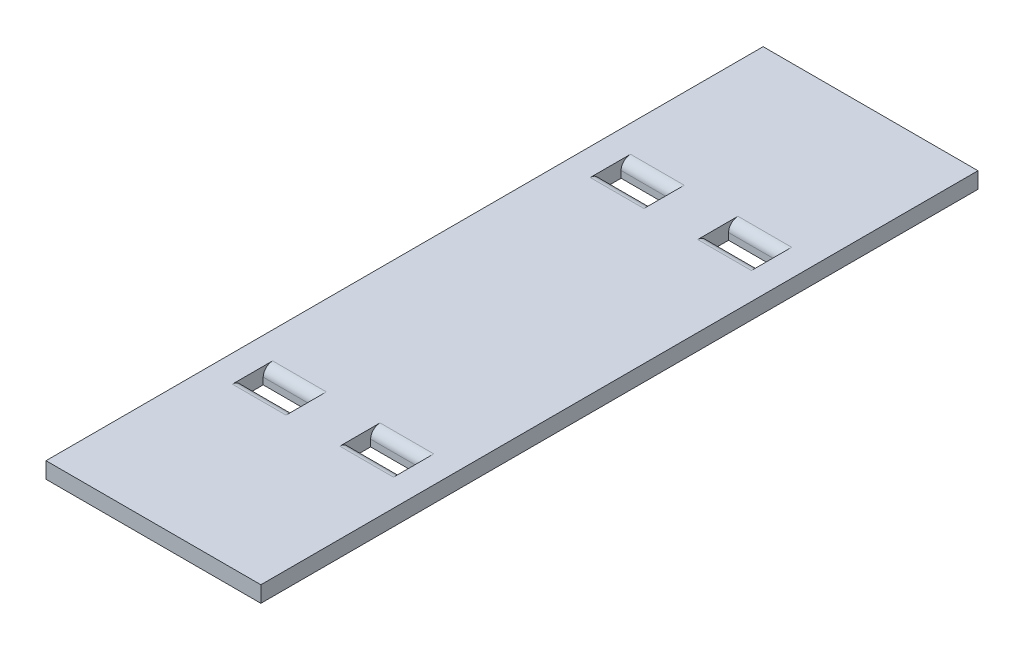
ISO-10303-21;
HEADER;
FILE_DESCRIPTION(('STEP AP214'),'2;1');
FILE_NAME('part.step','',(''),(''),'','','');
FILE_SCHEMA(('AUTOMOTIVE_DESIGN { 1 0 10303 214 1 1 1 1 }'));
ENDSEC;
DATA;
#1=APPLICATION_CONTEXT('core data for automotive mechanical design processes');
#2=APPLICATION_PROTOCOL_DEFINITION('international standard','automotive_design',2000,#1);
#3=PRODUCT_CONTEXT('',#1,'mechanical');
#4=PRODUCT('Part','Part','',(#3));
#5=PRODUCT_RELATED_PRODUCT_CATEGORY('part','',(#4));
#6=PRODUCT_DEFINITION_FORMATION('','',#4);
#7=PRODUCT_DEFINITION_CONTEXT('part definition',#1,'design');
#8=PRODUCT_DEFINITION('design','',#6,#7);
#9=PRODUCT_DEFINITION_SHAPE('','',#8);
#10=(LENGTH_UNIT() NAMED_UNIT(*) SI_UNIT(.MILLI.,.METRE.));
#11=(NAMED_UNIT(*) PLANE_ANGLE_UNIT() SI_UNIT($,.RADIAN.));
#12=(NAMED_UNIT(*) SI_UNIT($,.STERADIAN.) SOLID_ANGLE_UNIT());
#13=UNCERTAINTY_MEASURE_WITH_UNIT(LENGTH_MEASURE(1.E-05),#10,'distance_accuracy_value','');
#14=(GEOMETRIC_REPRESENTATION_CONTEXT(3) GLOBAL_UNCERTAINTY_ASSIGNED_CONTEXT((#13)) GLOBAL_UNIT_ASSIGNED_CONTEXT((#10,
#11,#12)) REPRESENTATION_CONTEXT('',''));
#15=CARTESIAN_POINT('',(0.,0.,0.));
#16=DIRECTION('',(0.,0.,1.));
#17=DIRECTION('',(1.,0.,0.));
#18=AXIS2_PLACEMENT_3D('',#15,#16,#17);
#19=CARTESIAN_POINT('',(20.,3.,-66.75));
#20=DIRECTION('',(-1.,0.,0.));
#21=DIRECTION('',(0.,0.,1.));
#22=AXIS2_PLACEMENT_3D('',#19,#20,#21);
#23=PLANE('',#22);
#24=DIRECTION('',(0.,0.,-1.));
#25=VECTOR('',#24,1.);
#26=CARTESIAN_POINT('',(20.,0.,-66.75));
#27=LINE('',#26,#25);
#28=CARTESIAN_POINT('',(20.,0.,66.75));
#29=VERTEX_POINT('',#28);
#30=CARTESIAN_POINT('',(20.,0.,-66.75));
#31=VERTEX_POINT('',#30);
#32=EDGE_CURVE('E340',#29,#31,#27,.T.);
#33=ORIENTED_EDGE('',*,*,#32,.T.);
#34=DIRECTION('',(0.,-1.,0.));
#35=VECTOR('',#34,1.);
#36=CARTESIAN_POINT('',(20.,3.,-66.75));
#37=LINE('',#36,#35);
#38=CARTESIAN_POINT('',(20.,3.,-66.75));
#39=VERTEX_POINT('',#38);
#40=EDGE_CURVE('E367',#39,#31,#37,.T.);
#41=ORIENTED_EDGE('',*,*,#40,.F.);
#42=DIRECTION('',(0.,0.,-1.));
#43=VECTOR('',#42,1.);
#44=CARTESIAN_POINT('',(20.,3.,-66.75));
#45=LINE('',#44,#43);
#46=CARTESIAN_POINT('',(20.,3.,66.75));
#47=VERTEX_POINT('',#46);
#48=EDGE_CURVE('E341',#47,#39,#45,.T.);
#49=ORIENTED_EDGE('',*,*,#48,.F.);
#50=DIRECTION('',(0.,-1.,0.));
#51=VECTOR('',#50,1.);
#52=CARTESIAN_POINT('',(20.,3.,66.75));
#53=LINE('',#52,#51);
#54=EDGE_CURVE('E351',#47,#29,#53,.T.);
#55=ORIENTED_EDGE('',*,*,#54,.T.);
#56=EDGE_LOOP('',(#33,#41,#49,#55));
#57=FACE_BOUND('',#56,.T.);
#58=ADVANCED_FACE('F41',(#57),#23,.F.);
#59=CARTESIAN_POINT('',(-20.,3.,-66.75));
#60=DIRECTION('',(0.,0.,1.));
#61=DIRECTION('',(1.,0.,0.));
#62=AXIS2_PLACEMENT_3D('',#59,#60,#61);
#63=PLANE('',#62);
#64=DIRECTION('',(-1.,0.,0.));
#65=VECTOR('',#64,1.);
#66=CARTESIAN_POINT('',(-20.,0.,-66.75));
#67=LINE('',#66,#65);
#68=CARTESIAN_POINT('',(-20.,0.,-66.75));
#69=VERTEX_POINT('',#68);
#70=EDGE_CURVE('E354',#31,#69,#67,.T.);
#71=ORIENTED_EDGE('',*,*,#70,.T.);
#72=DIRECTION('',(0.,-1.,0.));
#73=VECTOR('',#72,1.);
#74=CARTESIAN_POINT('',(-20.,3.,-66.75));
#75=LINE('',#74,#73);
#76=CARTESIAN_POINT('',(-20.,3.,-66.75));
#77=VERTEX_POINT('',#76);
#78=EDGE_CURVE('E364',#77,#69,#75,.T.);
#79=ORIENTED_EDGE('',*,*,#78,.F.);
#80=DIRECTION('',(-1.,0.,0.));
#81=VECTOR('',#80,1.);
#82=CARTESIAN_POINT('',(-20.,3.,-66.75));
#83=LINE('',#82,#81);
#84=EDGE_CURVE('E344',#39,#77,#83,.T.);
#85=ORIENTED_EDGE('',*,*,#84,.F.);
#86=ORIENTED_EDGE('',*,*,#40,.T.);
#87=EDGE_LOOP('',(#71,#79,#85,#86));
#88=FACE_BOUND('',#87,.T.);
#89=ADVANCED_FACE('F495',(#88),#63,.F.);
#90=CARTESIAN_POINT('',(-20.,3.,-66.75));
#91=DIRECTION('',(1.,0.,0.));
#92=DIRECTION('',(0.,0.,-1.));
#93=AXIS2_PLACEMENT_3D('',#90,#91,#92);
#94=PLANE('',#93);
#95=DIRECTION('',(0.,0.,1.));
#96=VECTOR('',#95,1.);
#97=CARTESIAN_POINT('',(-20.,0.,-66.75));
#98=LINE('',#97,#96);
#99=CARTESIAN_POINT('',(-20.,0.,66.75));
#100=VERTEX_POINT('',#99);
#101=EDGE_CURVE('E356',#69,#100,#98,.T.);
#102=ORIENTED_EDGE('',*,*,#101,.T.);
#103=DIRECTION('',(0.,-1.,0.));
#104=VECTOR('',#103,1.);
#105=CARTESIAN_POINT('',(-20.,3.,66.75));
#106=LINE('',#105,#104);
#107=CARTESIAN_POINT('',(-20.,3.,66.75));
#108=VERTEX_POINT('',#107);
#109=EDGE_CURVE('E361',#108,#100,#106,.T.);
#110=ORIENTED_EDGE('',*,*,#109,.F.);
#111=DIRECTION('',(0.,0.,1.));
#112=VECTOR('',#111,1.);
#113=CARTESIAN_POINT('',(-20.,3.,-66.75));
#114=LINE('',#113,#112);
#115=EDGE_CURVE('E347',#77,#108,#114,.T.);
#116=ORIENTED_EDGE('',*,*,#115,.F.);
#117=ORIENTED_EDGE('',*,*,#78,.T.);
#118=EDGE_LOOP('',(#102,#110,#116,#117));
#119=FACE_BOUND('',#118,.T.);
#120=ADVANCED_FACE('F501',(#119),#94,.F.);
#121=CARTESIAN_POINT('',(-20.,3.,66.75));
#122=DIRECTION('',(0.,0.,-1.));
#123=DIRECTION('',(-1.,0.,0.));
#124=AXIS2_PLACEMENT_3D('',#121,#122,#123);
#125=PLANE('',#124);
#126=DIRECTION('',(1.,0.,0.));
#127=VECTOR('',#126,1.);
#128=CARTESIAN_POINT('',(-20.,0.,66.75));
#129=LINE('',#128,#127);
#130=EDGE_CURVE('E345',#100,#29,#129,.T.);
#131=ORIENTED_EDGE('',*,*,#130,.T.);
#132=ORIENTED_EDGE('',*,*,#54,.F.);
#133=DIRECTION('',(1.,0.,0.));
#134=VECTOR('',#133,1.);
#135=CARTESIAN_POINT('',(-20.,3.,66.75));
#136=LINE('',#135,#134);
#137=EDGE_CURVE('E349',#108,#47,#136,.T.);
#138=ORIENTED_EDGE('',*,*,#137,.F.);
#139=ORIENTED_EDGE('',*,*,#109,.T.);
#140=EDGE_LOOP('',(#131,#132,#138,#139));
#141=FACE_BOUND('',#140,.T.);
#142=ADVANCED_FACE('F570',(#141),#125,.F.);
#143=CARTESIAN_POINT('',(0.,3.,0.));
#144=DIRECTION('',(0.,1.,0.));
#145=DIRECTION('',(0.,0.,1.));
#146=AXIS2_PLACEMENT_3D('',#143,#144,#145);
#147=PLANE('',#146);
#148=DIRECTION('',(0.,0.,-1.));
#149=VECTOR('',#148,1.);
#150=CARTESIAN_POINT('',(15.,3.,35.3125));
#151=LINE('',#150,#149);
#152=CARTESIAN_POINT('',(15.,3.,37.0625));
#153=VERTEX_POINT('',#152);
#154=CARTESIAN_POINT('',(15.,3.,29.5625));
#155=VERTEX_POINT('',#154);
#156=EDGE_CURVE('E296',#153,#155,#151,.T.);
#157=ORIENTED_EDGE('',*,*,#156,.F.);
#158=DIRECTION('',(1.,0.,0.));
#159=VECTOR('',#158,1.);
#160=CARTESIAN_POINT('',(5.,3.,37.0625));
#161=LINE('',#160,#159);
#162=CARTESIAN_POINT('',(5.,3.,37.0625));
#163=VERTEX_POINT('',#162);
#164=EDGE_CURVE('E388',#153,#163,#161,.F.);
#165=ORIENTED_EDGE('',*,*,#164,.T.);
#166=DIRECTION('',(0.,0.,1.));
#167=VECTOR('',#166,1.);
#168=CARTESIAN_POINT('',(5.,3.,35.3125));
#169=LINE('',#168,#167);
#170=CARTESIAN_POINT('',(5.,3.,29.5625));
#171=VERTEX_POINT('',#170);
#172=EDGE_CURVE('E305',#171,#163,#169,.T.);
#173=ORIENTED_EDGE('',*,*,#172,.F.);
#174=DIRECTION('',(-1.,0.,0.));
#175=VECTOR('',#174,1.);
#176=CARTESIAN_POINT('',(15.,3.,29.5625));
#177=LINE('',#176,#175);
#178=EDGE_CURVE('E385',#171,#155,#177,.F.);
#179=ORIENTED_EDGE('',*,*,#178,.T.);
#180=EDGE_LOOP('',(#157,#165,#173,#179));
#181=FACE_BOUND('',#180,.T.);
#182=DIRECTION('',(0.,0.,-1.));
#183=VECTOR('',#182,1.);
#184=CARTESIAN_POINT('',(-5.,3.,35.3125));
#185=LINE('',#184,#183);
#186=CARTESIAN_POINT('',(-5.,3.,37.0625));
#187=VERTEX_POINT('',#186);
#188=CARTESIAN_POINT('',(-5.,3.,29.5625));
#189=VERTEX_POINT('',#188);
#190=EDGE_CURVE('E279',#187,#189,#185,.T.);
#191=ORIENTED_EDGE('',*,*,#190,.F.);
#192=DIRECTION('',(1.,0.,0.));
#193=VECTOR('',#192,1.);
#194=CARTESIAN_POINT('',(-15.,3.,37.0625));
#195=LINE('',#194,#193);
#196=CARTESIAN_POINT('',(-15.,3.,37.0625));
#197=VERTEX_POINT('',#196);
#198=EDGE_CURVE('E394',#187,#197,#195,.F.);
#199=ORIENTED_EDGE('',*,*,#198,.T.);
#200=DIRECTION('',(0.,0.,1.));
#201=VECTOR('',#200,1.);
#202=CARTESIAN_POINT('',(-15.,3.,35.3125));
#203=LINE('',#202,#201);
#204=CARTESIAN_POINT('',(-15.,3.,29.5625));
#205=VERTEX_POINT('',#204);
#206=EDGE_CURVE('E269',#205,#197,#203,.T.);
#207=ORIENTED_EDGE('',*,*,#206,.F.);
#208=DIRECTION('',(-1.,0.,0.));
#209=VECTOR('',#208,1.);
#210=CARTESIAN_POINT('',(-5.,3.,29.5625));
#211=LINE('',#210,#209);
#212=EDGE_CURVE('E391',#205,#189,#211,.F.);
#213=ORIENTED_EDGE('',*,*,#212,.T.);
#214=EDGE_LOOP('',(#191,#199,#207,#213));
#215=FACE_BOUND('',#214,.T.);
#216=DIRECTION('',(0.,0.,1.));
#217=VECTOR('',#216,1.);
#218=CARTESIAN_POINT('',(-15.,3.,-35.3125));
#219=LINE('',#218,#217);
#220=CARTESIAN_POINT('',(-15.,3.,-37.0625));
#221=VERTEX_POINT('',#220);
#222=CARTESIAN_POINT('',(-15.,3.,-29.5625));
#223=VERTEX_POINT('',#222);
#224=EDGE_CURVE('E937',#221,#223,#219,.T.);
#225=ORIENTED_EDGE('',*,*,#224,.F.);
#226=DIRECTION('',(-1.,0.,0.));
#227=VECTOR('',#226,1.);
#228=CARTESIAN_POINT('',(-5.,3.,-37.0625));
#229=LINE('',#228,#227);
#230=CARTESIAN_POINT('',(-5.,3.,-37.0625));
#231=VERTEX_POINT('',#230);
#232=EDGE_CURVE('E400',#221,#231,#229,.F.);
#233=ORIENTED_EDGE('',*,*,#232,.T.);
#234=DIRECTION('',(0.,0.,-1.));
#235=VECTOR('',#234,1.);
#236=CARTESIAN_POINT('',(-5.,3.,-35.3125));
#237=LINE('',#236,#235);
#238=CARTESIAN_POINT('',(-5.,3.,-29.5625));
#239=VERTEX_POINT('',#238);
#240=EDGE_CURVE('E251',#239,#231,#237,.T.);
#241=ORIENTED_EDGE('',*,*,#240,.F.);
#242=DIRECTION('',(1.,0.,0.));
#243=VECTOR('',#242,1.);
#244=CARTESIAN_POINT('',(-15.,3.,-29.5625));
#245=LINE('',#244,#243);
#246=EDGE_CURVE('E397',#239,#223,#245,.F.);
#247=ORIENTED_EDGE('',*,*,#246,.T.);
#248=EDGE_LOOP('',(#225,#233,#241,#247));
#249=FACE_BOUND('',#248,.T.);
#250=DIRECTION('',(0.,0.,1.));
#251=VECTOR('',#250,1.);
#252=CARTESIAN_POINT('',(5.,3.,-35.3125));
#253=LINE('',#252,#251);
#254=CARTESIAN_POINT('',(5.,3.,-37.0625));
#255=VERTEX_POINT('',#254);
#256=CARTESIAN_POINT('',(5.,3.,-29.5625));
#257=VERTEX_POINT('',#256);
#258=EDGE_CURVE('E323',#255,#257,#253,.T.);
#259=ORIENTED_EDGE('',*,*,#258,.F.);
#260=DIRECTION('',(-1.,0.,0.));
#261=VECTOR('',#260,1.);
#262=CARTESIAN_POINT('',(15.,3.,-37.0625));
#263=LINE('',#262,#261);
#264=CARTESIAN_POINT('',(15.,3.,-37.0625));
#265=VERTEX_POINT('',#264);
#266=EDGE_CURVE('E406',#255,#265,#263,.F.);
#267=ORIENTED_EDGE('',*,*,#266,.T.);
#268=DIRECTION('',(0.,0.,-1.));
#269=VECTOR('',#268,1.);
#270=CARTESIAN_POINT('',(15.,3.,-35.3125));
#271=LINE('',#270,#269);
#272=CARTESIAN_POINT('',(15.,3.,-29.5625));
#273=VERTEX_POINT('',#272);
#274=EDGE_CURVE('E321',#273,#265,#271,.T.);
#275=ORIENTED_EDGE('',*,*,#274,.F.);
#276=DIRECTION('',(1.,0.,0.));
#277=VECTOR('',#276,1.);
#278=CARTESIAN_POINT('',(5.,3.,-29.5625));
#279=LINE('',#278,#277);
#280=EDGE_CURVE('E403',#273,#257,#279,.F.);
#281=ORIENTED_EDGE('',*,*,#280,.T.);
#282=EDGE_LOOP('',(#259,#267,#275,#281));
#283=FACE_BOUND('',#282,.T.);
#284=ORIENTED_EDGE('',*,*,#48,.T.);
#285=ORIENTED_EDGE('',*,*,#84,.T.);
#286=ORIENTED_EDGE('',*,*,#115,.T.);
#287=ORIENTED_EDGE('',*,*,#137,.T.);
#288=EDGE_LOOP('',(#284,#285,#286,#287));
#289=FACE_BOUND('',#288,.T.);
#290=ADVANCED_FACE('F567',(#181,#215,#249,#283,#289),#147,.T.);
#291=CARTESIAN_POINT('',(0.,0.,0.));
#292=DIRECTION('',(0.,1.,0.));
#293=DIRECTION('',(0.,0.,1.));
#294=AXIS2_PLACEMENT_3D('',#291,#292,#293);
#295=PLANE('',#294);
#296=DIRECTION('',(1.,0.,0.));
#297=VECTOR('',#296,1.);
#298=CARTESIAN_POINT('',(5.,0.,31.3125));
#299=LINE('',#298,#297);
#300=CARTESIAN_POINT('',(5.,0.,31.3125));
#301=VERTEX_POINT('',#300);
#302=CARTESIAN_POINT('',(15.,0.,31.3125));
#303=VERTEX_POINT('',#302);
#304=EDGE_CURVE('E310',#301,#303,#299,.T.);
#305=ORIENTED_EDGE('',*,*,#304,.F.);
#306=DIRECTION('',(0.,0.,-1.));
#307=VECTOR('',#306,1.);
#308=CARTESIAN_POINT('',(5.,0.,35.3125));
#309=LINE('',#308,#307);
#310=CARTESIAN_POINT('',(5.,0.,35.3125));
#311=VERTEX_POINT('',#310);
#312=EDGE_CURVE('E307',#311,#301,#309,.T.);
#313=ORIENTED_EDGE('',*,*,#312,.F.);
#314=DIRECTION('',(-1.,0.,0.));
#315=VECTOR('',#314,1.);
#316=CARTESIAN_POINT('',(5.,0.,35.3125));
#317=LINE('',#316,#315);
#318=CARTESIAN_POINT('',(15.,0.,35.3125));
#319=VERTEX_POINT('',#318);
#320=EDGE_CURVE('E289',#319,#311,#317,.T.);
#321=ORIENTED_EDGE('',*,*,#320,.F.);
#322=DIRECTION('',(0.,0.,1.));
#323=VECTOR('',#322,1.);
#324=CARTESIAN_POINT('',(15.,0.,35.3125));
#325=LINE('',#324,#323);
#326=EDGE_CURVE('E265',#303,#319,#325,.T.);
#327=ORIENTED_EDGE('',*,*,#326,.F.);
#328=EDGE_LOOP('',(#305,#313,#321,#327));
#329=FACE_BOUND('',#328,.T.);
#330=DIRECTION('',(0.,0.,-1.));
#331=VECTOR('',#330,1.);
#332=CARTESIAN_POINT('',(-15.,0.,35.3125));
#333=LINE('',#332,#331);
#334=CARTESIAN_POINT('',(-15.,0.,35.3125));
#335=VERTEX_POINT('',#334);
#336=CARTESIAN_POINT('',(-15.,0.,31.3125));
#337=VERTEX_POINT('',#336);
#338=EDGE_CURVE('E284',#335,#337,#333,.T.);
#339=ORIENTED_EDGE('',*,*,#338,.F.);
#340=DIRECTION('',(-1.,0.,0.));
#341=VECTOR('',#340,1.);
#342=CARTESIAN_POINT('',(-5.,0.,35.3125));
#343=LINE('',#342,#341);
#344=CARTESIAN_POINT('',(-5.,0.,35.3125));
#345=VERTEX_POINT('',#344);
#346=EDGE_CURVE('E281',#345,#335,#343,.T.);
#347=ORIENTED_EDGE('',*,*,#346,.F.);
#348=DIRECTION('',(0.,0.,1.));
#349=VECTOR('',#348,1.);
#350=CARTESIAN_POINT('',(-5.,0.,35.3125));
#351=LINE('',#350,#349);
#352=CARTESIAN_POINT('',(-5.,0.,31.3125));
#353=VERTEX_POINT('',#352);
#354=EDGE_CURVE('E261',#353,#345,#351,.T.);
#355=ORIENTED_EDGE('',*,*,#354,.F.);
#356=DIRECTION('',(1.,0.,0.));
#357=VECTOR('',#356,1.);
#358=CARTESIAN_POINT('',(-5.,0.,31.3125));
#359=LINE('',#358,#357);
#360=EDGE_CURVE('E287',#337,#353,#359,.T.);
#361=ORIENTED_EDGE('',*,*,#360,.F.);
#362=EDGE_LOOP('',(#339,#347,#355,#361));
#363=FACE_BOUND('',#362,.T.);
#364=DIRECTION('',(-1.,0.,0.));
#365=VECTOR('',#364,1.);
#366=CARTESIAN_POINT('',(-5.,0.,-31.3125));
#367=LINE('',#366,#365);
#368=CARTESIAN_POINT('',(-5.,0.,-31.3125));
#369=VERTEX_POINT('',#368);
#370=CARTESIAN_POINT('',(-15.,0.,-31.3125));
#371=VERTEX_POINT('',#370);
#372=EDGE_CURVE('E234',#369,#371,#367,.T.);
#373=ORIENTED_EDGE('',*,*,#372,.F.);
#374=DIRECTION('',(0.,0.,1.));
#375=VECTOR('',#374,1.);
#376=CARTESIAN_POINT('',(-5.,0.,-35.3125));
#377=LINE('',#376,#375);
#378=CARTESIAN_POINT('',(-5.,0.,-35.3125));
#379=VERTEX_POINT('',#378);
#380=EDGE_CURVE('E244',#379,#369,#377,.T.);
#381=ORIENTED_EDGE('',*,*,#380,.F.);
#382=DIRECTION('',(1.,0.,0.));
#383=VECTOR('',#382,1.);
#384=CARTESIAN_POINT('',(-5.,0.,-35.3125));
#385=LINE('',#384,#383);
#386=CARTESIAN_POINT('',(-15.,0.,-35.3125));
#387=VERTEX_POINT('',#386);
#388=EDGE_CURVE('E241',#387,#379,#385,.T.);
#389=ORIENTED_EDGE('',*,*,#388,.F.);
#390=DIRECTION('',(0.,0.,-1.));
#391=VECTOR('',#390,1.);
#392=CARTESIAN_POINT('',(-15.,0.,-35.3125));
#393=LINE('',#392,#391);
#394=EDGE_CURVE('E255',#371,#387,#393,.T.);
#395=ORIENTED_EDGE('',*,*,#394,.F.);
#396=EDGE_LOOP('',(#373,#381,#389,#395));
#397=FACE_BOUND('',#396,.T.);
#398=DIRECTION('',(-1.,0.,0.));
#399=VECTOR('',#398,1.);
#400=CARTESIAN_POINT('',(5.,0.,-31.3125));
#401=LINE('',#400,#399);
#402=CARTESIAN_POINT('',(15.,0.,-31.3125));
#403=VERTEX_POINT('',#402);
#404=CARTESIAN_POINT('',(5.,0.,-31.3125));
#405=VERTEX_POINT('',#404);
#406=EDGE_CURVE('E315',#403,#405,#401,.T.);
#407=ORIENTED_EDGE('',*,*,#406,.F.);
#408=DIRECTION('',(0.,0.,1.));
#409=VECTOR('',#408,1.);
#410=CARTESIAN_POINT('',(15.,0.,-35.3125));
#411=LINE('',#410,#409);
#412=CARTESIAN_POINT('',(15.,0.,-35.3125));
#413=VERTEX_POINT('',#412);
#414=EDGE_CURVE('E318',#413,#403,#411,.T.);
#415=ORIENTED_EDGE('',*,*,#414,.F.);
#416=DIRECTION('',(1.,0.,0.));
#417=VECTOR('',#416,1.);
#418=CARTESIAN_POINT('',(5.,0.,-35.3125));
#419=LINE('',#418,#417);
#420=CARTESIAN_POINT('',(5.,0.,-35.3125));
#421=VERTEX_POINT('',#420);
#422=EDGE_CURVE('E329',#421,#413,#419,.T.);
#423=ORIENTED_EDGE('',*,*,#422,.F.);
#424=DIRECTION('',(0.,0.,-1.));
#425=VECTOR('',#424,1.);
#426=CARTESIAN_POINT('',(5.,0.,-35.3125));
#427=LINE('',#426,#425);
#428=EDGE_CURVE('E257',#405,#421,#427,.T.);
#429=ORIENTED_EDGE('',*,*,#428,.F.);
#430=EDGE_LOOP('',(#407,#415,#423,#429));
#431=FACE_BOUND('',#430,.T.);
#432=CARTESIAN_POINT('',(10.,0.,-56.75));
#433=DIRECTION('',(0.,1.,0.));
#434=DIRECTION('',(0.,0.,1.));
#435=AXIS2_PLACEMENT_3D('',#432,#433,#434);
#436=CIRCLE('',#435,6.11);
#437=CARTESIAN_POINT('',(10.,0.,-50.64));
#438=VERTEX_POINT('',#437);
#439=EDGE_CURVE('E379',#438,#438,#436,.F.);
#440=ORIENTED_EDGE('',*,*,#439,.F.);
#441=EDGE_LOOP('',(#440));
#442=FACE_BOUND('',#441,.T.);
#443=CARTESIAN_POINT('',(-10.,0.,-56.75));
#444=DIRECTION('',(0.,1.,0.));
#445=DIRECTION('',(0.,0.,1.));
#446=AXIS2_PLACEMENT_3D('',#443,#444,#445);
#447=CIRCLE('',#446,6.11);
#448=CARTESIAN_POINT('',(-10.,0.,-50.64));
#449=VERTEX_POINT('',#448);
#450=EDGE_CURVE('E376',#449,#449,#447,.F.);
#451=ORIENTED_EDGE('',*,*,#450,.F.);
#452=EDGE_LOOP('',(#451));
#453=FACE_BOUND('',#452,.T.);
#454=CARTESIAN_POINT('',(-10.,0.,56.75));
#455=DIRECTION('',(0.,1.,0.));
#456=DIRECTION('',(0.,0.,1.));
#457=AXIS2_PLACEMENT_3D('',#454,#455,#456);
#458=CIRCLE('',#457,6.11);
#459=CARTESIAN_POINT('',(-10.,0.,62.86));
#460=VERTEX_POINT('',#459);
#461=EDGE_CURVE('E373',#460,#460,#458,.F.);
#462=ORIENTED_EDGE('',*,*,#461,.F.);
#463=EDGE_LOOP('',(#462));
#464=FACE_BOUND('',#463,.T.);
#465=CARTESIAN_POINT('',(10.,0.,56.75));
#466=DIRECTION('',(0.,1.,0.));
#467=DIRECTION('',(0.,0.,1.));
#468=AXIS2_PLACEMENT_3D('',#465,#466,#467);
#469=CIRCLE('',#468,6.11);
#470=CARTESIAN_POINT('',(10.,0.,62.86));
#471=VERTEX_POINT('',#470);
#472=EDGE_CURVE('E370',#471,#471,#469,.F.);
#473=ORIENTED_EDGE('',*,*,#472,.F.);
#474=EDGE_LOOP('',(#473));
#475=FACE_BOUND('',#474,.T.);
#476=ORIENTED_EDGE('',*,*,#32,.F.);
#477=ORIENTED_EDGE('',*,*,#130,.F.);
#478=ORIENTED_EDGE('',*,*,#101,.F.);
#479=ORIENTED_EDGE('',*,*,#70,.F.);
#480=EDGE_LOOP('',(#476,#477,#478,#479));
#481=FACE_BOUND('',#480,.T.);
#482=ADVANCED_FACE('F253',(#329,#363,#397,#431,#442,#453,#464,#475,#481),#295,.F.);
#483=CARTESIAN_POINT('',(10.,-3.,56.75));
#484=DIRECTION('',(0.,1.,0.));
#485=DIRECTION('',(0.,0.,1.));
#486=AXIS2_PLACEMENT_3D('',#483,#484,#485);
#487=CYLINDRICAL_SURFACE('',#486,6.11);
#488=CARTESIAN_POINT('',(10.,-2.,56.75));
#489=DIRECTION('',(0.,-1.,0.));
#490=DIRECTION('',(0.,0.,-1.));
#491=AXIS2_PLACEMENT_3D('',#488,#489,#490);
#492=CIRCLE('',#491,6.11);
#493=CARTESIAN_POINT('',(10.,-2.,50.64));
#494=VERTEX_POINT('',#493);
#495=EDGE_CURVE('E472',#494,#494,#492,.F.);
#496=ORIENTED_EDGE('',*,*,#495,.T.);
#497=EDGE_LOOP('',(#496));
#498=FACE_BOUND('',#497,.T.);
#499=ORIENTED_EDGE('',*,*,#472,.T.);
#500=EDGE_LOOP('',(#499));
#501=FACE_BOUND('',#500,.T.);
#502=ADVANCED_FACE('F553',(#498,#501),#487,.T.);
#503=CARTESIAN_POINT('',(10.,-3.,56.75));
#504=DIRECTION('',(0.,-1.,0.));
#505=DIRECTION('',(0.,0.,-1.));
#506=AXIS2_PLACEMENT_3D('',#503,#504,#505);
#507=PLANE('',#506);
#508=CARTESIAN_POINT('',(10.,-3.,56.75));
#509=DIRECTION('',(0.,-1.,0.));
#510=DIRECTION('',(0.,0.,-1.));
#511=AXIS2_PLACEMENT_3D('',#508,#509,#510);
#512=CIRCLE('',#511,5.11);
#513=CARTESIAN_POINT('',(10.,-3.,51.64));
#514=VERTEX_POINT('',#513);
#515=EDGE_CURVE('E469',#514,#514,#512,.T.);
#516=ORIENTED_EDGE('',*,*,#515,.T.);
#517=EDGE_LOOP('',(#516));
#518=FACE_BOUND('',#517,.T.);
#519=ADVANCED_FACE('F550',(#518),#507,.T.);
#520=CARTESIAN_POINT('',(-10.,-3.,56.75));
#521=DIRECTION('',(0.,1.,0.));
#522=DIRECTION('',(0.,0.,1.));
#523=AXIS2_PLACEMENT_3D('',#520,#521,#522);
#524=CYLINDRICAL_SURFACE('',#523,6.11);
#525=CARTESIAN_POINT('',(-10.,-2.,56.75));
#526=DIRECTION('',(0.,1.,0.));
#527=DIRECTION('',(0.,0.,1.));
#528=AXIS2_PLACEMENT_3D('',#525,#526,#527);
#529=CIRCLE('',#528,6.11);
#530=CARTESIAN_POINT('',(-10.,-2.,62.86));
#531=VERTEX_POINT('',#530);
#532=EDGE_CURVE('E466',#531,#531,#529,.T.);
#533=ORIENTED_EDGE('',*,*,#532,.T.);
#534=EDGE_LOOP('',(#533));
#535=FACE_BOUND('',#534,.T.);
#536=ORIENTED_EDGE('',*,*,#461,.T.);
#537=EDGE_LOOP('',(#536));
#538=FACE_BOUND('',#537,.T.);
#539=ADVANCED_FACE('F552',(#535,#538),#524,.T.);
#540=CARTESIAN_POINT('',(-10.,-3.,56.75));
#541=DIRECTION('',(0.,1.,0.));
#542=DIRECTION('',(0.,0.,1.));
#543=AXIS2_PLACEMENT_3D('',#540,#541,#542);
#544=PLANE('',#543);
#545=CARTESIAN_POINT('',(-10.,-3.,56.75));
#546=DIRECTION('',(0.,1.,0.));
#547=DIRECTION('',(0.,0.,1.));
#548=AXIS2_PLACEMENT_3D('',#545,#546,#547);
#549=CIRCLE('',#548,5.11);
#550=CARTESIAN_POINT('',(-10.,-3.,61.86));
#551=VERTEX_POINT('',#550);
#552=EDGE_CURVE('E463',#551,#551,#549,.F.);
#553=ORIENTED_EDGE('',*,*,#552,.T.);
#554=EDGE_LOOP('',(#553));
#555=FACE_BOUND('',#554,.T.);
#556=ADVANCED_FACE('F559',(#555),#544,.F.);
#557=CARTESIAN_POINT('',(-10.,-3.,-56.75));
#558=DIRECTION('',(0.,1.,0.));
#559=DIRECTION('',(0.,0.,1.));
#560=AXIS2_PLACEMENT_3D('',#557,#558,#559);
#561=CYLINDRICAL_SURFACE('',#560,6.11);
#562=CARTESIAN_POINT('',(-10.,-2.,-56.75));
#563=DIRECTION('',(0.,-1.,0.));
#564=DIRECTION('',(0.,0.,-1.));
#565=AXIS2_PLACEMENT_3D('',#562,#563,#564);
#566=CIRCLE('',#565,6.11);
#567=CARTESIAN_POINT('',(-10.,-2.,-62.86));
#568=VERTEX_POINT('',#567);
#569=EDGE_CURVE('E478',#568,#568,#566,.F.);
#570=ORIENTED_EDGE('',*,*,#569,.T.);
#571=EDGE_LOOP('',(#570));
#572=FACE_BOUND('',#571,.T.);
#573=ORIENTED_EDGE('',*,*,#450,.T.);
#574=EDGE_LOOP('',(#573));
#575=FACE_BOUND('',#574,.T.);
#576=ADVANCED_FACE('F815',(#572,#575),#561,.T.);
#577=CARTESIAN_POINT('',(-10.,-3.,-56.75));
#578=DIRECTION('',(0.,-1.,0.));
#579=DIRECTION('',(0.,0.,-1.));
#580=AXIS2_PLACEMENT_3D('',#577,#578,#579);
#581=PLANE('',#580);
#582=CARTESIAN_POINT('',(-10.,-3.,-56.75));
#583=DIRECTION('',(0.,-1.,0.));
#584=DIRECTION('',(0.,0.,-1.));
#585=AXIS2_PLACEMENT_3D('',#582,#583,#584);
#586=CIRCLE('',#585,5.11);
#587=CARTESIAN_POINT('',(-10.,-3.,-61.86));
#588=VERTEX_POINT('',#587);
#589=EDGE_CURVE('E475',#588,#588,#586,.T.);
#590=ORIENTED_EDGE('',*,*,#589,.T.);
#591=EDGE_LOOP('',(#590));
#592=FACE_BOUND('',#591,.T.);
#593=ADVANCED_FACE('F825',(#592),#581,.T.);
#594=CARTESIAN_POINT('',(10.,-3.,-56.75));
#595=DIRECTION('',(0.,1.,0.));
#596=DIRECTION('',(0.,0.,1.));
#597=AXIS2_PLACEMENT_3D('',#594,#595,#596);
#598=CYLINDRICAL_SURFACE('',#597,6.11);
#599=CARTESIAN_POINT('',(10.,-2.,-56.75));
#600=DIRECTION('',(0.,1.,0.));
#601=DIRECTION('',(0.,0.,1.));
#602=AXIS2_PLACEMENT_3D('',#599,#600,#601);
#603=CIRCLE('',#602,6.11);
#604=CARTESIAN_POINT('',(10.,-2.,-50.64));
#605=VERTEX_POINT('',#604);
#606=EDGE_CURVE('E11',#605,#605,#603,.T.);
#607=ORIENTED_EDGE('',*,*,#606,.T.);
#608=EDGE_LOOP('',(#607));
#609=FACE_BOUND('',#608,.T.);
#610=ORIENTED_EDGE('',*,*,#439,.T.);
#611=EDGE_LOOP('',(#610));
#612=FACE_BOUND('',#611,.T.);
#613=ADVANCED_FACE('F835',(#609,#612),#598,.T.);
#614=CARTESIAN_POINT('',(10.,-3.,-56.75));
#615=DIRECTION('',(0.,1.,0.));
#616=DIRECTION('',(0.,0.,1.));
#617=AXIS2_PLACEMENT_3D('',#614,#615,#616);
#618=PLANE('',#617);
#619=CARTESIAN_POINT('',(10.,-3.,-56.75));
#620=DIRECTION('',(0.,1.,0.));
#621=DIRECTION('',(0.,0.,1.));
#622=AXIS2_PLACEMENT_3D('',#619,#620,#621);
#623=CIRCLE('',#622,5.11);
#624=CARTESIAN_POINT('',(10.,-3.,-51.64));
#625=VERTEX_POINT('',#624);
#626=EDGE_CURVE('E49',#625,#625,#623,.F.);
#627=ORIENTED_EDGE('',*,*,#626,.T.);
#628=EDGE_LOOP('',(#627));
#629=FACE_BOUND('',#628,.T.);
#630=ADVANCED_FACE('F483',(#629),#618,.F.);
#631=CARTESIAN_POINT('',(15.,-3.001,-35.3125));
#632=DIRECTION('',(1.,0.,0.));
#633=DIRECTION('',(0.,0.,-1.));
#634=AXIS2_PLACEMENT_3D('',#631,#632,#633);
#635=PLANE('',#634);
#636=ORIENTED_EDGE('',*,*,#414,.T.);
#637=DIRECTION('',(0.,1.,0.));
#638=VECTOR('',#637,1.);
#639=CARTESIAN_POINT('',(15.,-3.001,-31.3125));
#640=LINE('',#639,#638);
#641=CARTESIAN_POINT('',(15.,1.25,-31.3125));
#642=VERTEX_POINT('',#641);
#643=EDGE_CURVE('E326',#403,#642,#640,.T.);
#644=ORIENTED_EDGE('',*,*,#643,.T.);
#645=CARTESIAN_POINT('',(15.,1.25,-29.5625));
#646=DIRECTION('',(1.,0.,0.));
#647=DIRECTION('',(0.,0.,-1.));
#648=AXIS2_PLACEMENT_3D('',#645,#646,#647);
#649=CIRCLE('',#648,1.75);
#650=EDGE_CURVE('E432',#642,#273,#649,.T.);
#651=ORIENTED_EDGE('',*,*,#650,.T.);
#652=ORIENTED_EDGE('',*,*,#274,.T.);
#653=CARTESIAN_POINT('',(15.,1.25,-37.0625));
#654=DIRECTION('',(1.,0.,0.));
#655=DIRECTION('',(0.,0.,-1.));
#656=AXIS2_PLACEMENT_3D('',#653,#654,#655);
#657=CIRCLE('',#656,1.75);
#658=CARTESIAN_POINT('',(15.,1.25,-35.3125));
#659=VERTEX_POINT('',#658);
#660=EDGE_CURVE('E430',#265,#659,#657,.T.);
#661=ORIENTED_EDGE('',*,*,#660,.T.);
#662=DIRECTION('',(0.,1.,0.));
#663=VECTOR('',#662,1.);
#664=CARTESIAN_POINT('',(15.,-3.001,-35.3125));
#665=LINE('',#664,#663);
#666=EDGE_CURVE('E325',#413,#659,#665,.T.);
#667=ORIENTED_EDGE('',*,*,#666,.F.);
#668=EDGE_LOOP('',(#636,#644,#651,#652,#661,#667));
#669=FACE_BOUND('',#668,.T.);
#670=ADVANCED_FACE('F615',(#669),#635,.F.);
#671=CARTESIAN_POINT('',(5.,-3.001,-31.3125));
#672=DIRECTION('',(0.,0.,1.));
#673=DIRECTION('',(1.,0.,0.));
#674=AXIS2_PLACEMENT_3D('',#671,#672,#673);
#675=PLANE('',#674);
#676=DIRECTION('',(0.,1.,0.));
#677=VECTOR('',#676,1.);
#678=CARTESIAN_POINT('',(5.,-3.001,-31.3125));
#679=LINE('',#678,#677);
#680=CARTESIAN_POINT('',(5.,1.25,-31.3125));
#681=VERTEX_POINT('',#680);
#682=EDGE_CURVE('E330',#405,#681,#679,.T.);
#683=ORIENTED_EDGE('',*,*,#682,.T.);
#684=DIRECTION('',(1.,0.,0.));
#685=VECTOR('',#684,1.);
#686=CARTESIAN_POINT('',(15.,1.25,-31.3125));
#687=LINE('',#686,#685);
#688=EDGE_CURVE('E409',#681,#642,#687,.T.);
#689=ORIENTED_EDGE('',*,*,#688,.T.);
#690=ORIENTED_EDGE('',*,*,#643,.F.);
#691=ORIENTED_EDGE('',*,*,#406,.T.);
#692=EDGE_LOOP('',(#683,#689,#690,#691));
#693=FACE_BOUND('',#692,.T.);
#694=ADVANCED_FACE('F619',(#693),#675,.F.);
#695=CARTESIAN_POINT('',(5.,-3.001,-35.3125));
#696=DIRECTION('',(-1.,0.,0.));
#697=DIRECTION('',(0.,0.,1.));
#698=AXIS2_PLACEMENT_3D('',#695,#696,#697);
#699=PLANE('',#698);
#700=ORIENTED_EDGE('',*,*,#428,.T.);
#701=DIRECTION('',(0.,1.,0.));
#702=VECTOR('',#701,1.);
#703=CARTESIAN_POINT('',(5.,-3.001,-35.3125));
#704=LINE('',#703,#702);
#705=CARTESIAN_POINT('',(5.,1.25,-35.3125));
#706=VERTEX_POINT('',#705);
#707=EDGE_CURVE('E333',#421,#706,#704,.T.);
#708=ORIENTED_EDGE('',*,*,#707,.T.);
#709=CARTESIAN_POINT('',(5.,1.25,-37.0625));
#710=DIRECTION('',(-1.,0.,0.));
#711=DIRECTION('',(0.,0.,1.));
#712=AXIS2_PLACEMENT_3D('',#709,#710,#711);
#713=CIRCLE('',#712,1.75);
#714=EDGE_CURVE('E427',#706,#255,#713,.T.);
#715=ORIENTED_EDGE('',*,*,#714,.T.);
#716=ORIENTED_EDGE('',*,*,#258,.T.);
#717=CARTESIAN_POINT('',(5.,1.25,-29.5625));
#718=DIRECTION('',(-1.,0.,0.));
#719=DIRECTION('',(0.,0.,1.));
#720=AXIS2_PLACEMENT_3D('',#717,#718,#719);
#721=CIRCLE('',#720,1.75);
#722=EDGE_CURVE('E435',#257,#681,#721,.T.);
#723=ORIENTED_EDGE('',*,*,#722,.T.);
#724=ORIENTED_EDGE('',*,*,#682,.F.);
#725=EDGE_LOOP('',(#700,#708,#715,#716,#723,#724));
#726=FACE_BOUND('',#725,.T.);
#727=ADVANCED_FACE('F629',(#726),#699,.F.);
#728=CARTESIAN_POINT('',(5.,-3.001,-35.3125));
#729=DIRECTION('',(0.,0.,-1.));
#730=DIRECTION('',(-1.,0.,0.));
#731=AXIS2_PLACEMENT_3D('',#728,#729,#730);
#732=PLANE('',#731);
#733=ORIENTED_EDGE('',*,*,#666,.T.);
#734=DIRECTION('',(-1.,0.,0.));
#735=VECTOR('',#734,1.);
#736=CARTESIAN_POINT('',(5.,1.25,-35.3125));
#737=LINE('',#736,#735);
#738=EDGE_CURVE('E382',#659,#706,#737,.T.);
#739=ORIENTED_EDGE('',*,*,#738,.T.);
#740=ORIENTED_EDGE('',*,*,#707,.F.);
#741=ORIENTED_EDGE('',*,*,#422,.T.);
#742=EDGE_LOOP('',(#733,#739,#740,#741));
#743=FACE_BOUND('',#742,.T.);
#744=ADVANCED_FACE('F638',(#743),#732,.F.);
#745=CARTESIAN_POINT('',(-5.,-3.001,-35.3125));
#746=DIRECTION('',(1.,0.,0.));
#747=DIRECTION('',(0.,0.,-1.));
#748=AXIS2_PLACEMENT_3D('',#745,#746,#747);
#749=PLANE('',#748);
#750=ORIENTED_EDGE('',*,*,#380,.T.);
#751=DIRECTION('',(0.,1.,0.));
#752=VECTOR('',#751,1.);
#753=CARTESIAN_POINT('',(-5.,-3.001,-31.3125));
#754=LINE('',#753,#752);
#755=CARTESIAN_POINT('',(-5.,1.25,-31.3125));
#756=VERTEX_POINT('',#755);
#757=EDGE_CURVE('E229',#369,#756,#754,.T.);
#758=ORIENTED_EDGE('',*,*,#757,.T.);
#759=CARTESIAN_POINT('',(-5.,1.25,-29.5625));
#760=DIRECTION('',(1.,0.,0.));
#761=DIRECTION('',(0.,0.,-1.));
#762=AXIS2_PLACEMENT_3D('',#759,#760,#761);
#763=CIRCLE('',#762,1.75);
#764=EDGE_CURVE('E442',#756,#239,#763,.T.);
#765=ORIENTED_EDGE('',*,*,#764,.T.);
#766=ORIENTED_EDGE('',*,*,#240,.T.);
#767=CARTESIAN_POINT('',(-5.,1.25,-37.0625));
#768=DIRECTION('',(1.,0.,0.));
#769=DIRECTION('',(0.,0.,-1.));
#770=AXIS2_PLACEMENT_3D('',#767,#768,#769);
#771=CIRCLE('',#770,1.75);
#772=CARTESIAN_POINT('',(-5.,1.25,-35.3125));
#773=VERTEX_POINT('',#772);
#774=EDGE_CURVE('E440',#231,#773,#771,.T.);
#775=ORIENTED_EDGE('',*,*,#774,.T.);
#776=DIRECTION('',(0.,1.,0.));
#777=VECTOR('',#776,1.);
#778=CARTESIAN_POINT('',(-5.,-3.001,-35.3125));
#779=LINE('',#778,#777);
#780=EDGE_CURVE('E247',#379,#773,#779,.T.);
#781=ORIENTED_EDGE('',*,*,#780,.F.);
#782=EDGE_LOOP('',(#750,#758,#765,#766,#775,#781));
#783=FACE_BOUND('',#782,.T.);
#784=ADVANCED_FACE('F245',(#783),#749,.F.);
#785=CARTESIAN_POINT('',(-5.,-3.001,-31.3125));
#786=DIRECTION('',(0.,0.,1.));
#787=DIRECTION('',(1.,0.,0.));
#788=AXIS2_PLACEMENT_3D('',#785,#786,#787);
#789=PLANE('',#788);
#790=DIRECTION('',(0.,1.,0.));
#791=VECTOR('',#790,1.);
#792=CARTESIAN_POINT('',(-15.,-3.001,-31.3125));
#793=LINE('',#792,#791);
#794=CARTESIAN_POINT('',(-15.,1.25,-31.3125));
#795=VERTEX_POINT('',#794);
#796=EDGE_CURVE('E240',#371,#795,#793,.T.);
#797=ORIENTED_EDGE('',*,*,#796,.T.);
#798=DIRECTION('',(1.,0.,0.));
#799=VECTOR('',#798,1.);
#800=CARTESIAN_POINT('',(-5.,1.25,-31.3125));
#801=LINE('',#800,#799);
#802=EDGE_CURVE('E237',#795,#756,#801,.T.);
#803=ORIENTED_EDGE('',*,*,#802,.T.);
#804=ORIENTED_EDGE('',*,*,#757,.F.);
#805=ORIENTED_EDGE('',*,*,#372,.T.);
#806=EDGE_LOOP('',(#797,#803,#804,#805));
#807=FACE_BOUND('',#806,.T.);
#808=ADVANCED_FACE('F232',(#807),#789,.F.);
#809=CARTESIAN_POINT('',(-15.,-3.001,-35.3125));
#810=DIRECTION('',(-1.,0.,0.));
#811=DIRECTION('',(0.,0.,1.));
#812=AXIS2_PLACEMENT_3D('',#809,#810,#811);
#813=PLANE('',#812);
#814=ORIENTED_EDGE('',*,*,#394,.T.);
#815=DIRECTION('',(0.,1.,0.));
#816=VECTOR('',#815,1.);
#817=CARTESIAN_POINT('',(-15.,-3.001,-35.3125));
#818=LINE('',#817,#816);
#819=CARTESIAN_POINT('',(-15.,1.25,-35.3125));
#820=VERTEX_POINT('',#819);
#821=EDGE_CURVE('E956',#387,#820,#818,.T.);
#822=ORIENTED_EDGE('',*,*,#821,.T.);
#823=CARTESIAN_POINT('',(-15.,1.25,-37.0625));
#824=DIRECTION('',(-1.,0.,0.));
#825=DIRECTION('',(0.,0.,1.));
#826=AXIS2_PLACEMENT_3D('',#823,#824,#825);
#827=CIRCLE('',#826,1.75);
#828=EDGE_CURVE('E437',#820,#221,#827,.T.);
#829=ORIENTED_EDGE('',*,*,#828,.T.);
#830=ORIENTED_EDGE('',*,*,#224,.T.);
#831=CARTESIAN_POINT('',(-15.,1.25,-29.5625));
#832=DIRECTION('',(-1.,0.,0.));
#833=DIRECTION('',(0.,0.,1.));
#834=AXIS2_PLACEMENT_3D('',#831,#832,#833);
#835=CIRCLE('',#834,1.75);
#836=EDGE_CURVE('E444',#223,#795,#835,.T.);
#837=ORIENTED_EDGE('',*,*,#836,.T.);
#838=ORIENTED_EDGE('',*,*,#796,.F.);
#839=EDGE_LOOP('',(#814,#822,#829,#830,#837,#838));
#840=FACE_BOUND('',#839,.T.);
#841=ADVANCED_FACE('F662',(#840),#813,.F.);
#842=CARTESIAN_POINT('',(-5.,-3.001,-35.3125));
#843=DIRECTION('',(0.,0.,-1.));
#844=DIRECTION('',(-1.,0.,0.));
#845=AXIS2_PLACEMENT_3D('',#842,#843,#844);
#846=PLANE('',#845);
#847=ORIENTED_EDGE('',*,*,#780,.T.);
#848=DIRECTION('',(-1.,0.,0.));
#849=VECTOR('',#848,1.);
#850=CARTESIAN_POINT('',(-15.,1.25,-35.3125));
#851=LINE('',#850,#849);
#852=EDGE_CURVE('E412',#773,#820,#851,.T.);
#853=ORIENTED_EDGE('',*,*,#852,.T.);
#854=ORIENTED_EDGE('',*,*,#821,.F.);
#855=ORIENTED_EDGE('',*,*,#388,.T.);
#856=EDGE_LOOP('',(#847,#853,#854,#855));
#857=FACE_BOUND('',#856,.T.);
#858=ADVANCED_FACE('F670',(#857),#846,.F.);
#859=CARTESIAN_POINT('',(-5.,-3.001,35.3125));
#860=DIRECTION('',(0.,0.,1.));
#861=DIRECTION('',(1.,0.,0.));
#862=AXIS2_PLACEMENT_3D('',#859,#860,#861);
#863=PLANE('',#862);
#864=DIRECTION('',(0.,1.,0.));
#865=VECTOR('',#864,1.);
#866=CARTESIAN_POINT('',(-15.,-3.001,35.3125));
#867=LINE('',#866,#865);
#868=CARTESIAN_POINT('',(-15.,1.25,35.3125));
#869=VERTEX_POINT('',#868);
#870=EDGE_CURVE('E264',#335,#869,#867,.T.);
#871=ORIENTED_EDGE('',*,*,#870,.T.);
#872=DIRECTION('',(1.,0.,0.));
#873=VECTOR('',#872,1.);
#874=CARTESIAN_POINT('',(-5.,1.25,35.3125));
#875=LINE('',#874,#873);
#876=CARTESIAN_POINT('',(-5.,1.25,35.3125));
#877=VERTEX_POINT('',#876);
#878=EDGE_CURVE('E416',#869,#877,#875,.T.);
#879=ORIENTED_EDGE('',*,*,#878,.T.);
#880=DIRECTION('',(0.,1.,0.));
#881=VECTOR('',#880,1.);
#882=CARTESIAN_POINT('',(-5.,-3.001,35.3125));
#883=LINE('',#882,#881);
#884=EDGE_CURVE('E266',#345,#877,#883,.T.);
#885=ORIENTED_EDGE('',*,*,#884,.F.);
#886=ORIENTED_EDGE('',*,*,#346,.T.);
#887=EDGE_LOOP('',(#871,#879,#885,#886));
#888=FACE_BOUND('',#887,.T.);
#889=ADVANCED_FACE('F679',(#888),#863,.F.);
#890=CARTESIAN_POINT('',(-15.,-3.001,35.3125));
#891=DIRECTION('',(-1.,0.,0.));
#892=DIRECTION('',(0.,0.,1.));
#893=AXIS2_PLACEMENT_3D('',#890,#891,#892);
#894=PLANE('',#893);
#895=ORIENTED_EDGE('',*,*,#338,.T.);
#896=DIRECTION('',(0.,1.,0.));
#897=VECTOR('',#896,1.);
#898=CARTESIAN_POINT('',(-15.,-3.001,31.3125));
#899=LINE('',#898,#897);
#900=CARTESIAN_POINT('',(-15.,1.25,31.3125));
#901=VERTEX_POINT('',#900);
#902=EDGE_CURVE('E273',#337,#901,#899,.T.);
#903=ORIENTED_EDGE('',*,*,#902,.T.);
#904=CARTESIAN_POINT('',(-15.,1.25,29.5625));
#905=DIRECTION('',(-1.,0.,0.));
#906=DIRECTION('',(0.,0.,1.));
#907=AXIS2_PLACEMENT_3D('',#904,#905,#906);
#908=CIRCLE('',#907,1.75);
#909=EDGE_CURVE('E451',#901,#205,#908,.T.);
#910=ORIENTED_EDGE('',*,*,#909,.T.);
#911=ORIENTED_EDGE('',*,*,#206,.T.);
#912=CARTESIAN_POINT('',(-15.,1.25,37.0625));
#913=DIRECTION('',(-1.,0.,0.));
#914=DIRECTION('',(0.,0.,1.));
#915=AXIS2_PLACEMENT_3D('',#912,#913,#914);
#916=CIRCLE('',#915,1.75);
#917=EDGE_CURVE('E449',#197,#869,#916,.T.);
#918=ORIENTED_EDGE('',*,*,#917,.T.);
#919=ORIENTED_EDGE('',*,*,#870,.F.);
#920=EDGE_LOOP('',(#895,#903,#910,#911,#918,#919));
#921=FACE_BOUND('',#920,.T.);
#922=ADVANCED_FACE('F688',(#921),#894,.F.);
#923=CARTESIAN_POINT('',(-5.,-3.001,31.3125));
#924=DIRECTION('',(0.,0.,-1.));
#925=DIRECTION('',(-1.,0.,0.));
#926=AXIS2_PLACEMENT_3D('',#923,#924,#925);
#927=PLANE('',#926);
#928=DIRECTION('',(0.,1.,0.));
#929=VECTOR('',#928,1.);
#930=CARTESIAN_POINT('',(-5.,-3.001,31.3125));
#931=LINE('',#930,#929);
#932=CARTESIAN_POINT('',(-5.,1.25,31.3125));
#933=VERTEX_POINT('',#932);
#934=EDGE_CURVE('E270',#353,#933,#931,.T.);
#935=ORIENTED_EDGE('',*,*,#934,.T.);
#936=DIRECTION('',(-1.,0.,0.));
#937=VECTOR('',#936,1.);
#938=CARTESIAN_POINT('',(-15.,1.25,31.3125));
#939=LINE('',#938,#937);
#940=EDGE_CURVE('E419',#933,#901,#939,.T.);
#941=ORIENTED_EDGE('',*,*,#940,.T.);
#942=ORIENTED_EDGE('',*,*,#902,.F.);
#943=ORIENTED_EDGE('',*,*,#360,.T.);
#944=EDGE_LOOP('',(#935,#941,#942,#943));
#945=FACE_BOUND('',#944,.T.);
#946=ADVANCED_FACE('F697',(#945),#927,.F.);
#947=CARTESIAN_POINT('',(-5.,-3.001,35.3125));
#948=DIRECTION('',(1.,0.,0.));
#949=DIRECTION('',(0.,0.,-1.));
#950=AXIS2_PLACEMENT_3D('',#947,#948,#949);
#951=PLANE('',#950);
#952=ORIENTED_EDGE('',*,*,#354,.T.);
#953=ORIENTED_EDGE('',*,*,#884,.T.);
#954=CARTESIAN_POINT('',(-5.,1.25,37.0625));
#955=DIRECTION('',(1.,0.,0.));
#956=DIRECTION('',(0.,0.,-1.));
#957=AXIS2_PLACEMENT_3D('',#954,#955,#956);
#958=CIRCLE('',#957,1.75);
#959=EDGE_CURVE('E446',#877,#187,#958,.T.);
#960=ORIENTED_EDGE('',*,*,#959,.T.);
#961=ORIENTED_EDGE('',*,*,#190,.T.);
#962=CARTESIAN_POINT('',(-5.,1.25,29.5625));
#963=DIRECTION('',(1.,0.,0.));
#964=DIRECTION('',(0.,0.,-1.));
#965=AXIS2_PLACEMENT_3D('',#962,#963,#964);
#966=CIRCLE('',#965,1.75);
#967=EDGE_CURVE('E454',#189,#933,#966,.T.);
#968=ORIENTED_EDGE('',*,*,#967,.T.);
#969=ORIENTED_EDGE('',*,*,#934,.F.);
#970=EDGE_LOOP('',(#952,#953,#960,#961,#968,#969));
#971=FACE_BOUND('',#970,.T.);
#972=ADVANCED_FACE('F706',(#971),#951,.F.);
#973=CARTESIAN_POINT('',(5.,-3.001,35.3125));
#974=DIRECTION('',(-1.,0.,0.));
#975=DIRECTION('',(0.,0.,1.));
#976=AXIS2_PLACEMENT_3D('',#973,#974,#975);
#977=PLANE('',#976);
#978=ORIENTED_EDGE('',*,*,#312,.T.);
#979=DIRECTION('',(0.,1.,0.));
#980=VECTOR('',#979,1.);
#981=CARTESIAN_POINT('',(5.,-3.001,31.3125));
#982=LINE('',#981,#980);
#983=CARTESIAN_POINT('',(5.,1.25,31.3125));
#984=VERTEX_POINT('',#983);
#985=EDGE_CURVE('E292',#301,#984,#982,.T.);
#986=ORIENTED_EDGE('',*,*,#985,.T.);
#987=CARTESIAN_POINT('',(5.,1.25,29.5625));
#988=DIRECTION('',(-1.,0.,0.));
#989=DIRECTION('',(0.,0.,1.));
#990=AXIS2_PLACEMENT_3D('',#987,#988,#989);
#991=CIRCLE('',#990,1.75);
#992=EDGE_CURVE('E56',#984,#171,#991,.T.);
#993=ORIENTED_EDGE('',*,*,#992,.T.);
#994=ORIENTED_EDGE('',*,*,#172,.T.);
#995=CARTESIAN_POINT('',(5.,1.25,37.0625));
#996=DIRECTION('',(-1.,0.,0.));
#997=DIRECTION('',(0.,0.,1.));
#998=AXIS2_PLACEMENT_3D('',#995,#996,#997);
#999=CIRCLE('',#998,1.75);
#1000=CARTESIAN_POINT('',(5.,1.25,35.3125));
#1001=VERTEX_POINT('',#1000);
#1002=EDGE_CURVE('E459',#163,#1001,#999,.T.);
#1003=ORIENTED_EDGE('',*,*,#1002,.T.);
#1004=DIRECTION('',(0.,1.,0.));
#1005=VECTOR('',#1004,1.);
#1006=CARTESIAN_POINT('',(5.,-3.001,35.3125));
#1007=LINE('',#1006,#1005);
#1008=EDGE_CURVE('E293',#311,#1001,#1007,.T.);
#1009=ORIENTED_EDGE('',*,*,#1008,.F.);
#1010=EDGE_LOOP('',(#978,#986,#993,#994,#1003,#1009));
#1011=FACE_BOUND('',#1010,.T.);
#1012=ADVANCED_FACE('F715',(#1011),#977,.F.);
#1013=CARTESIAN_POINT('',(5.,-3.001,31.3125));
#1014=DIRECTION('',(0.,0.,-1.));
#1015=DIRECTION('',(-1.,0.,0.));
#1016=AXIS2_PLACEMENT_3D('',#1013,#1014,#1015);
#1017=PLANE('',#1016);
#1018=DIRECTION('',(0.,1.,0.));
#1019=VECTOR('',#1018,1.);
#1020=CARTESIAN_POINT('',(15.,-3.001,31.3125));
#1021=LINE('',#1020,#1019);
#1022=CARTESIAN_POINT('',(15.,1.25,31.3125));
#1023=VERTEX_POINT('',#1022);
#1024=EDGE_CURVE('E300',#303,#1023,#1021,.T.);
#1025=ORIENTED_EDGE('',*,*,#1024,.T.);
#1026=DIRECTION('',(-1.,0.,0.));
#1027=VECTOR('',#1026,1.);
#1028=CARTESIAN_POINT('',(5.,1.25,31.3125));
#1029=LINE('',#1028,#1027);
#1030=EDGE_CURVE('E425',#1023,#984,#1029,.T.);
#1031=ORIENTED_EDGE('',*,*,#1030,.T.);
#1032=ORIENTED_EDGE('',*,*,#985,.F.);
#1033=ORIENTED_EDGE('',*,*,#304,.T.);
#1034=EDGE_LOOP('',(#1025,#1031,#1032,#1033));
#1035=FACE_BOUND('',#1034,.T.);
#1036=ADVANCED_FACE('F724',(#1035),#1017,.F.);
#1037=CARTESIAN_POINT('',(15.,-3.001,35.3125));
#1038=DIRECTION('',(1.,0.,0.));
#1039=DIRECTION('',(0.,0.,-1.));
#1040=AXIS2_PLACEMENT_3D('',#1037,#1038,#1039);
#1041=PLANE('',#1040);
#1042=ORIENTED_EDGE('',*,*,#326,.T.);
#1043=DIRECTION('',(0.,1.,0.));
#1044=VECTOR('',#1043,1.);
#1045=CARTESIAN_POINT('',(15.,-3.001,35.3125));
#1046=LINE('',#1045,#1044);
#1047=CARTESIAN_POINT('',(15.,1.25,35.3125));
#1048=VERTEX_POINT('',#1047);
#1049=EDGE_CURVE('E297',#319,#1048,#1046,.T.);
#1050=ORIENTED_EDGE('',*,*,#1049,.T.);
#1051=CARTESIAN_POINT('',(15.,1.25,37.0625));
#1052=DIRECTION('',(1.,0.,0.));
#1053=DIRECTION('',(0.,0.,-1.));
#1054=AXIS2_PLACEMENT_3D('',#1051,#1052,#1053);
#1055=CIRCLE('',#1054,1.75);
#1056=EDGE_CURVE('E456',#1048,#153,#1055,.T.);
#1057=ORIENTED_EDGE('',*,*,#1056,.T.);
#1058=ORIENTED_EDGE('',*,*,#156,.T.);
#1059=CARTESIAN_POINT('',(15.,1.25,29.5625));
#1060=DIRECTION('',(1.,0.,0.));
#1061=DIRECTION('',(0.,0.,-1.));
#1062=AXIS2_PLACEMENT_3D('',#1059,#1060,#1061);
#1063=CIRCLE('',#1062,1.75);
#1064=EDGE_CURVE('E64',#155,#1023,#1063,.T.);
#1065=ORIENTED_EDGE('',*,*,#1064,.T.);
#1066=ORIENTED_EDGE('',*,*,#1024,.F.);
#1067=EDGE_LOOP('',(#1042,#1050,#1057,#1058,#1065,#1066));
#1068=FACE_BOUND('',#1067,.T.);
#1069=ADVANCED_FACE('F733',(#1068),#1041,.F.);
#1070=CARTESIAN_POINT('',(5.,-3.001,35.3125));
#1071=DIRECTION('',(0.,0.,1.));
#1072=DIRECTION('',(1.,0.,0.));
#1073=AXIS2_PLACEMENT_3D('',#1070,#1071,#1072);
#1074=PLANE('',#1073);
#1075=ORIENTED_EDGE('',*,*,#1008,.T.);
#1076=DIRECTION('',(1.,0.,0.));
#1077=VECTOR('',#1076,1.);
#1078=CARTESIAN_POINT('',(15.,1.25,35.3125));
#1079=LINE('',#1078,#1077);
#1080=EDGE_CURVE('E422',#1001,#1048,#1079,.T.);
#1081=ORIENTED_EDGE('',*,*,#1080,.T.);
#1082=ORIENTED_EDGE('',*,*,#1049,.F.);
#1083=ORIENTED_EDGE('',*,*,#320,.T.);
#1084=EDGE_LOOP('',(#1075,#1081,#1082,#1083));
#1085=FACE_BOUND('',#1084,.T.);
#1086=ADVANCED_FACE('F510',(#1085),#1074,.F.);
#1087=CARTESIAN_POINT('',(5.,1.25,-37.0625));
#1088=DIRECTION('',(1.,0.,0.));
#1089=DIRECTION('',(0.,0.,-1.));
#1090=AXIS2_PLACEMENT_3D('',#1087,#1088,#1089);
#1091=CYLINDRICAL_SURFACE('',#1090,1.75);
#1092=ORIENTED_EDGE('',*,*,#660,.F.);
#1093=ORIENTED_EDGE('',*,*,#266,.F.);
#1094=ORIENTED_EDGE('',*,*,#714,.F.);
#1095=ORIENTED_EDGE('',*,*,#738,.F.);
#1096=EDGE_LOOP('',(#1092,#1093,#1094,#1095));
#1097=FACE_BOUND('',#1096,.T.);
#1098=ADVANCED_FACE('F506',(#1097),#1091,.T.);
#1099=CARTESIAN_POINT('',(5.,1.25,-29.5625));
#1100=DIRECTION('',(-1.,0.,0.));
#1101=DIRECTION('',(0.,0.,1.));
#1102=AXIS2_PLACEMENT_3D('',#1099,#1100,#1101);
#1103=CYLINDRICAL_SURFACE('',#1102,1.75);
#1104=ORIENTED_EDGE('',*,*,#722,.F.);
#1105=ORIENTED_EDGE('',*,*,#280,.F.);
#1106=ORIENTED_EDGE('',*,*,#650,.F.);
#1107=ORIENTED_EDGE('',*,*,#688,.F.);
#1108=EDGE_LOOP('',(#1104,#1105,#1106,#1107));
#1109=FACE_BOUND('',#1108,.T.);
#1110=ADVANCED_FACE('F509',(#1109),#1103,.T.);
#1111=CARTESIAN_POINT('',(-5.,1.25,-37.0625));
#1112=DIRECTION('',(1.,0.,0.));
#1113=DIRECTION('',(0.,0.,-1.));
#1114=AXIS2_PLACEMENT_3D('',#1111,#1112,#1113);
#1115=CYLINDRICAL_SURFACE('',#1114,1.75);
#1116=ORIENTED_EDGE('',*,*,#774,.F.);
#1117=ORIENTED_EDGE('',*,*,#232,.F.);
#1118=ORIENTED_EDGE('',*,*,#828,.F.);
#1119=ORIENTED_EDGE('',*,*,#852,.F.);
#1120=EDGE_LOOP('',(#1116,#1117,#1118,#1119));
#1121=FACE_BOUND('',#1120,.T.);
#1122=ADVANCED_FACE('F514',(#1121),#1115,.T.);
#1123=CARTESIAN_POINT('',(-5.,1.25,-29.5625));
#1124=DIRECTION('',(-1.,0.,0.));
#1125=DIRECTION('',(0.,0.,1.));
#1126=AXIS2_PLACEMENT_3D('',#1123,#1124,#1125);
#1127=CYLINDRICAL_SURFACE('',#1126,1.75);
#1128=ORIENTED_EDGE('',*,*,#836,.F.);
#1129=ORIENTED_EDGE('',*,*,#246,.F.);
#1130=ORIENTED_EDGE('',*,*,#764,.F.);
#1131=ORIENTED_EDGE('',*,*,#802,.F.);
#1132=EDGE_LOOP('',(#1128,#1129,#1130,#1131));
#1133=FACE_BOUND('',#1132,.T.);
#1134=ADVANCED_FACE('F518',(#1133),#1127,.T.);
#1135=CARTESIAN_POINT('',(-5.,1.25,37.0625));
#1136=DIRECTION('',(-1.,0.,0.));
#1137=DIRECTION('',(0.,0.,1.));
#1138=AXIS2_PLACEMENT_3D('',#1135,#1136,#1137);
#1139=CYLINDRICAL_SURFACE('',#1138,1.75);
#1140=ORIENTED_EDGE('',*,*,#917,.F.);
#1141=ORIENTED_EDGE('',*,*,#198,.F.);
#1142=ORIENTED_EDGE('',*,*,#959,.F.);
#1143=ORIENTED_EDGE('',*,*,#878,.F.);
#1144=EDGE_LOOP('',(#1140,#1141,#1142,#1143));
#1145=FACE_BOUND('',#1144,.T.);
#1146=ADVANCED_FACE('F522',(#1145),#1139,.T.);
#1147=CARTESIAN_POINT('',(-5.,1.25,29.5625));
#1148=DIRECTION('',(1.,0.,0.));
#1149=DIRECTION('',(0.,0.,-1.));
#1150=AXIS2_PLACEMENT_3D('',#1147,#1148,#1149);
#1151=CYLINDRICAL_SURFACE('',#1150,1.75);
#1152=ORIENTED_EDGE('',*,*,#967,.F.);
#1153=ORIENTED_EDGE('',*,*,#212,.F.);
#1154=ORIENTED_EDGE('',*,*,#909,.F.);
#1155=ORIENTED_EDGE('',*,*,#940,.F.);
#1156=EDGE_LOOP('',(#1152,#1153,#1154,#1155));
#1157=FACE_BOUND('',#1156,.T.);
#1158=ADVANCED_FACE('F526',(#1157),#1151,.T.);
#1159=CARTESIAN_POINT('',(5.,1.25,37.0625));
#1160=DIRECTION('',(-1.,0.,0.));
#1161=DIRECTION('',(0.,0.,1.));
#1162=AXIS2_PLACEMENT_3D('',#1159,#1160,#1161);
#1163=CYLINDRICAL_SURFACE('',#1162,1.75);
#1164=ORIENTED_EDGE('',*,*,#1002,.F.);
#1165=ORIENTED_EDGE('',*,*,#164,.F.);
#1166=ORIENTED_EDGE('',*,*,#1056,.F.);
#1167=ORIENTED_EDGE('',*,*,#1080,.F.);
#1168=EDGE_LOOP('',(#1164,#1165,#1166,#1167));
#1169=FACE_BOUND('',#1168,.T.);
#1170=ADVANCED_FACE('F530',(#1169),#1163,.T.);
#1171=CARTESIAN_POINT('',(5.,1.25,29.5625));
#1172=DIRECTION('',(1.,0.,0.));
#1173=DIRECTION('',(0.,0.,-1.));
#1174=AXIS2_PLACEMENT_3D('',#1171,#1172,#1173);
#1175=CYLINDRICAL_SURFACE('',#1174,1.75);
#1176=ORIENTED_EDGE('',*,*,#1064,.F.);
#1177=ORIENTED_EDGE('',*,*,#178,.F.);
#1178=ORIENTED_EDGE('',*,*,#992,.F.);
#1179=ORIENTED_EDGE('',*,*,#1030,.F.);
#1180=EDGE_LOOP('',(#1176,#1177,#1178,#1179));
#1181=FACE_BOUND('',#1180,.T.);
#1182=ADVANCED_FACE('F534',(#1181),#1175,.T.);
#1183=CARTESIAN_POINT('',(-10.,-2.,56.75));
#1184=DIRECTION('',(0.,1.,0.));
#1185=DIRECTION('',(0.,0.,1.));
#1186=AXIS2_PLACEMENT_3D('',#1183,#1184,#1185);
#1187=TOROIDAL_SURFACE('',#1186,5.11,1.);
#1188=ORIENTED_EDGE('',*,*,#532,.F.);
#1189=EDGE_LOOP('',(#1188));
#1190=FACE_BOUND('',#1189,.T.);
#1191=ORIENTED_EDGE('',*,*,#552,.F.);
#1192=EDGE_LOOP('',(#1191));
#1193=FACE_BOUND('',#1192,.T.);
#1194=ADVANCED_FACE('F538',(#1190,#1193),#1187,.T.);
#1195=CARTESIAN_POINT('',(10.,-2.,56.75));
#1196=DIRECTION('',(0.,-1.,0.));
#1197=DIRECTION('',(0.,0.,-1.));
#1198=AXIS2_PLACEMENT_3D('',#1195,#1196,#1197);
#1199=TOROIDAL_SURFACE('',#1198,5.11,1.);
#1200=ORIENTED_EDGE('',*,*,#495,.F.);
#1201=EDGE_LOOP('',(#1200));
#1202=FACE_BOUND('',#1201,.T.);
#1203=ORIENTED_EDGE('',*,*,#515,.F.);
#1204=EDGE_LOOP('',(#1203));
#1205=FACE_BOUND('',#1204,.T.);
#1206=ADVANCED_FACE('F491',(#1202,#1205),#1199,.T.);
#1207=CARTESIAN_POINT('',(-10.,-2.,-56.75));
#1208=DIRECTION('',(0.,-1.,0.));
#1209=DIRECTION('',(0.,0.,-1.));
#1210=AXIS2_PLACEMENT_3D('',#1207,#1208,#1209);
#1211=TOROIDAL_SURFACE('',#1210,5.11,1.);
#1212=ORIENTED_EDGE('',*,*,#569,.F.);
#1213=EDGE_LOOP('',(#1212));
#1214=FACE_BOUND('',#1213,.T.);
#1215=ORIENTED_EDGE('',*,*,#589,.F.);
#1216=EDGE_LOOP('',(#1215));
#1217=FACE_BOUND('',#1216,.T.);
#1218=ADVANCED_FACE('F486',(#1214,#1217),#1211,.T.);
#1219=CARTESIAN_POINT('',(10.,-2.,-56.75));
#1220=DIRECTION('',(0.,1.,0.));
#1221=DIRECTION('',(0.,0.,1.));
#1222=AXIS2_PLACEMENT_3D('',#1219,#1220,#1221);
#1223=TOROIDAL_SURFACE('',#1222,5.11,1.);
#1224=ORIENTED_EDGE('',*,*,#606,.F.);
#1225=EDGE_LOOP('',(#1224));
#1226=FACE_BOUND('',#1225,.T.);
#1227=ORIENTED_EDGE('',*,*,#626,.F.);
#1228=EDGE_LOOP('',(#1227));
#1229=FACE_BOUND('',#1228,.T.);
#1230=ADVANCED_FACE('F43',(#1226,#1229),#1223,.T.);
#1231=CLOSED_SHELL('',(#58,#89,#120,#142,#290,#482,#502,#519,#539,#556,#576,#593,#613,#630,#670,
#694,#727,#744,#784,#808,#841,#858,#889,#922,#946,#972,#1012,#1036,#1069,#1086,#1098,#1110,
#1122,#1134,#1146,#1158,#1170,#1182,#1194,#1206,#1218,#1230));
#1232=MANIFOLD_SOLID_BREP('B2',#1231);
#1233=ADVANCED_BREP_SHAPE_REPRESENTATION('',(#18,#1232),#14);
#1234=SHAPE_DEFINITION_REPRESENTATION(#9,#1233);
ENDSEC;
END-ISO-10303-21;
